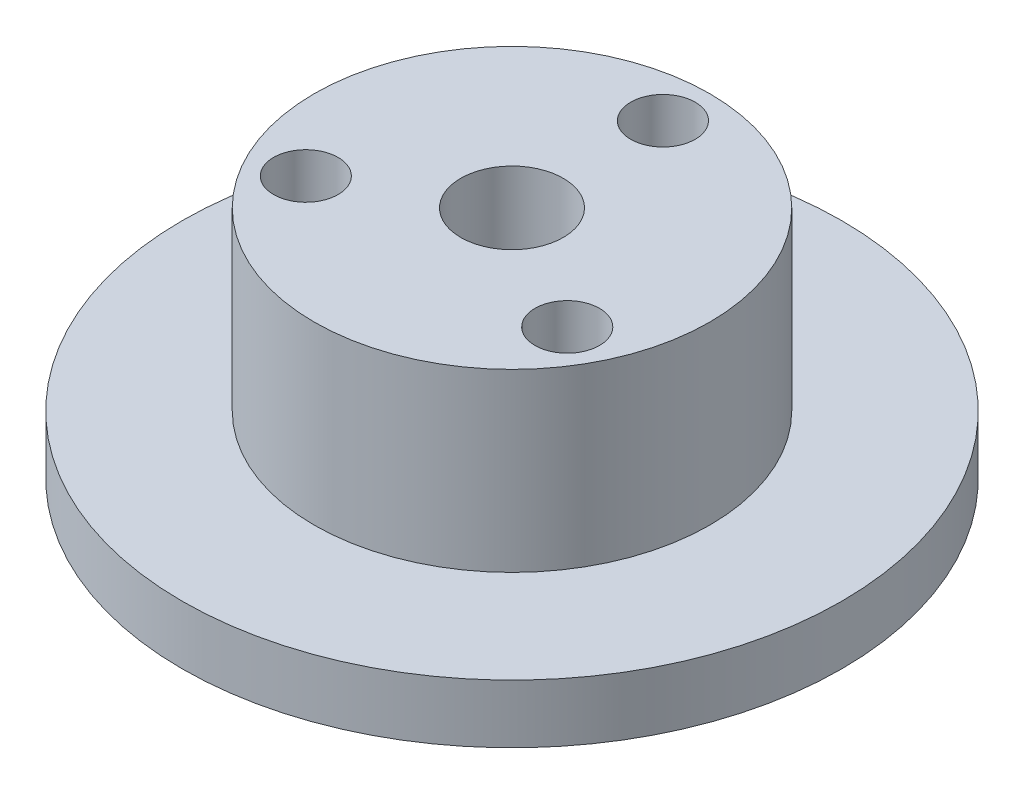
ISO-10303-21;
HEADER;
FILE_DESCRIPTION(('STEP AP214'),'2;1');
FILE_NAME('part.step','',(''),(''),'','','');
FILE_SCHEMA(('AUTOMOTIVE_DESIGN { 1 0 10303 214 1 1 1 1 }'));
ENDSEC;
DATA;
#1=APPLICATION_CONTEXT('core data for automotive mechanical design processes');
#2=APPLICATION_PROTOCOL_DEFINITION('international standard','automotive_design',2000,#1);
#3=PRODUCT_CONTEXT('',#1,'mechanical');
#4=PRODUCT('Part','Part','',(#3));
#5=PRODUCT_RELATED_PRODUCT_CATEGORY('part','',(#4));
#6=PRODUCT_DEFINITION_FORMATION('','',#4);
#7=PRODUCT_DEFINITION_CONTEXT('part definition',#1,'design');
#8=PRODUCT_DEFINITION('design','',#6,#7);
#9=PRODUCT_DEFINITION_SHAPE('','',#8);
#10=(LENGTH_UNIT() NAMED_UNIT(*) SI_UNIT(.MILLI.,.METRE.));
#11=(NAMED_UNIT(*) PLANE_ANGLE_UNIT() SI_UNIT($,.RADIAN.));
#12=(NAMED_UNIT(*) SI_UNIT($,.STERADIAN.) SOLID_ANGLE_UNIT());
#13=UNCERTAINTY_MEASURE_WITH_UNIT(LENGTH_MEASURE(1.E-05),#10,'distance_accuracy_value','');
#14=(GEOMETRIC_REPRESENTATION_CONTEXT(3) GLOBAL_UNCERTAINTY_ASSIGNED_CONTEXT((#13)) GLOBAL_UNIT_ASSIGNED_CONTEXT((#10,
#11,#12)) REPRESENTATION_CONTEXT('',''));
#15=CARTESIAN_POINT('',(0.,0.,0.));
#16=DIRECTION('',(0.,0.,1.));
#17=DIRECTION('',(1.,0.,0.));
#18=AXIS2_PLACEMENT_3D('',#15,#16,#17);
#19=CARTESIAN_POINT('',(0.,8.,0.));
#20=DIRECTION('',(0.,-1.,0.));
#21=DIRECTION('',(0.,0.,-1.));
#22=AXIS2_PLACEMENT_3D('',#19,#20,#21);
#23=CYLINDRICAL_SURFACE('',#22,11.25);
#24=CARTESIAN_POINT('',(0.,0.,0.));
#25=DIRECTION('',(0.,1.,0.));
#26=DIRECTION('',(0.,0.,1.));
#27=AXIS2_PLACEMENT_3D('',#24,#25,#26);
#28=CIRCLE('',#27,11.25);
#29=CARTESIAN_POINT('',(0.,0.,11.25));
#30=VERTEX_POINT('',#29);
#31=EDGE_CURVE('E10',#30,#30,#28,.T.);
#32=ORIENTED_EDGE('',*,*,#31,.T.);
#33=EDGE_LOOP('',(#32));
#34=FACE_BOUND('',#33,.T.);
#35=CARTESIAN_POINT('',(0.,2.,0.));
#36=DIRECTION('',(0.,1.,0.));
#37=DIRECTION('',(0.,0.,1.));
#38=AXIS2_PLACEMENT_3D('',#35,#36,#37);
#39=CIRCLE('',#38,11.25);
#40=CARTESIAN_POINT('',(0.,2.,11.25));
#41=VERTEX_POINT('',#40);
#42=EDGE_CURVE('E38',#41,#41,#39,.T.);
#43=ORIENTED_EDGE('',*,*,#42,.F.);
#44=EDGE_LOOP('',(#43));
#45=FACE_BOUND('',#44,.T.);
#46=ADVANCED_FACE('F32',(#34,#45),#23,.T.);
#47=CARTESIAN_POINT('',(0.,0.,0.));
#48=DIRECTION('',(0.,1.,0.));
#49=DIRECTION('',(0.,0.,1.));
#50=AXIS2_PLACEMENT_3D('',#47,#48,#49);
#51=PLANE('',#50);
#52=CARTESIAN_POINT('',(-4.46003082948953,0.,2.57500000000019));
#53=DIRECTION('',(0.,1.,0.));
#54=DIRECTION('',(0.,0.,1.));
#55=AXIS2_PLACEMENT_3D('',#52,#53,#54);
#56=CIRCLE('',#55,1.10000000000042);
#57=CARTESIAN_POINT('',(-4.46003082948953,0.,3.67500000000061));
#58=VERTEX_POINT('',#57);
#59=EDGE_CURVE('E61',#58,#58,#56,.T.);
#60=ORIENTED_EDGE('',*,*,#59,.T.);
#61=EDGE_LOOP('',(#60));
#62=FACE_BOUND('',#61,.T.);
#63=CARTESIAN_POINT('',(4.46003082949019,0.,2.57499999999981));
#64=DIRECTION('',(0.,1.,0.));
#65=DIRECTION('',(0.,0.,1.));
#66=AXIS2_PLACEMENT_3D('',#63,#64,#65);
#67=CIRCLE('',#66,1.10000000000028);
#68=CARTESIAN_POINT('',(4.46003082949019,0.,3.67500000000009));
#69=VERTEX_POINT('',#68);
#70=EDGE_CURVE('E67',#69,#69,#67,.T.);
#71=ORIENTED_EDGE('',*,*,#70,.T.);
#72=EDGE_LOOP('',(#71));
#73=FACE_BOUND('',#72,.T.);
#74=CARTESIAN_POINT('',(0.,0.,-5.15));
#75=DIRECTION('',(0.,1.,0.));
#76=DIRECTION('',(0.,0.,1.));
#77=AXIS2_PLACEMENT_3D('',#74,#75,#76);
#78=CIRCLE('',#77,1.1);
#79=CARTESIAN_POINT('',(0.,0.,-4.05));
#80=VERTEX_POINT('',#79);
#81=EDGE_CURVE('E55',#80,#80,#78,.T.);
#82=ORIENTED_EDGE('',*,*,#81,.T.);
#83=EDGE_LOOP('',(#82));
#84=FACE_BOUND('',#83,.T.);
#85=CARTESIAN_POINT('',(0.,0.,0.));
#86=DIRECTION('',(0.,1.,0.));
#87=DIRECTION('',(0.,0.,1.));
#88=AXIS2_PLACEMENT_3D('',#85,#86,#87);
#89=CIRCLE('',#88,1.75);
#90=CARTESIAN_POINT('',(0.,0.,1.75));
#91=VERTEX_POINT('',#90);
#92=EDGE_CURVE('E50',#91,#91,#89,.T.);
#93=ORIENTED_EDGE('',*,*,#92,.T.);
#94=EDGE_LOOP('',(#93));
#95=FACE_BOUND('',#94,.T.);
#96=ORIENTED_EDGE('',*,*,#31,.F.);
#97=EDGE_LOOP('',(#96));
#98=FACE_BOUND('',#97,.T.);
#99=ADVANCED_FACE('F76',(#62,#73,#84,#95,#98),#51,.F.);
#100=CARTESIAN_POINT('',(0.,2.,0.));
#101=DIRECTION('',(0.,1.,0.));
#102=DIRECTION('',(0.,0.,1.));
#103=AXIS2_PLACEMENT_3D('',#100,#101,#102);
#104=PLANE('',#103);
#105=CARTESIAN_POINT('',(0.,2.,0.));
#106=DIRECTION('',(0.,1.,0.));
#107=DIRECTION('',(0.,0.,1.));
#108=AXIS2_PLACEMENT_3D('',#105,#106,#107);
#109=CIRCLE('',#108,6.75);
#110=CARTESIAN_POINT('',(0.,2.,6.75));
#111=VERTEX_POINT('',#110);
#112=EDGE_CURVE('E42',#111,#111,#109,.T.);
#113=ORIENTED_EDGE('',*,*,#112,.F.);
#114=EDGE_LOOP('',(#113));
#115=FACE_BOUND('',#114,.T.);
#116=ORIENTED_EDGE('',*,*,#42,.T.);
#117=EDGE_LOOP('',(#116));
#118=FACE_BOUND('',#117,.T.);
#119=ADVANCED_FACE('F98',(#115,#118),#104,.T.);
#120=CARTESIAN_POINT('',(0.,2.,0.));
#121=DIRECTION('',(0.,1.,0.));
#122=DIRECTION('',(0.,0.,1.));
#123=AXIS2_PLACEMENT_3D('',#120,#121,#122);
#124=CYLINDRICAL_SURFACE('',#123,6.75);
#125=ORIENTED_EDGE('',*,*,#112,.T.);
#126=EDGE_LOOP('',(#125));
#127=FACE_BOUND('',#126,.T.);
#128=CARTESIAN_POINT('',(0.,8.,0.));
#129=DIRECTION('',(0.,1.,0.));
#130=DIRECTION('',(0.,0.,1.));
#131=AXIS2_PLACEMENT_3D('',#128,#129,#130);
#132=CIRCLE('',#131,6.75);
#133=CARTESIAN_POINT('',(0.,8.,6.75));
#134=VERTEX_POINT('',#133);
#135=EDGE_CURVE('E46',#134,#134,#132,.T.);
#136=ORIENTED_EDGE('',*,*,#135,.F.);
#137=EDGE_LOOP('',(#136));
#138=FACE_BOUND('',#137,.T.);
#139=ADVANCED_FACE('F90',(#127,#138),#124,.T.);
#140=CARTESIAN_POINT('',(0.,8.,0.));
#141=DIRECTION('',(0.,1.,0.));
#142=DIRECTION('',(0.,0.,1.));
#143=AXIS2_PLACEMENT_3D('',#140,#141,#142);
#144=PLANE('',#143);
#145=CARTESIAN_POINT('',(-4.46003082948953,8.,2.57500000000019));
#146=DIRECTION('',(0.,1.,0.));
#147=DIRECTION('',(0.,0.,1.));
#148=AXIS2_PLACEMENT_3D('',#145,#146,#147);
#149=CIRCLE('',#148,1.10000000000042);
#150=CARTESIAN_POINT('',(-4.46003082948953,8.,3.67500000000061));
#151=VERTEX_POINT('',#150);
#152=EDGE_CURVE('E58',#151,#151,#149,.T.);
#153=ORIENTED_EDGE('',*,*,#152,.F.);
#154=EDGE_LOOP('',(#153));
#155=FACE_BOUND('',#154,.T.);
#156=CARTESIAN_POINT('',(4.46003082949019,8.,2.57499999999981));
#157=DIRECTION('',(0.,1.,0.));
#158=DIRECTION('',(0.,0.,1.));
#159=AXIS2_PLACEMENT_3D('',#156,#157,#158);
#160=CIRCLE('',#159,1.10000000000028);
#161=CARTESIAN_POINT('',(4.46003082949019,8.,3.67500000000009));
#162=VERTEX_POINT('',#161);
#163=EDGE_CURVE('E64',#162,#162,#160,.T.);
#164=ORIENTED_EDGE('',*,*,#163,.F.);
#165=EDGE_LOOP('',(#164));
#166=FACE_BOUND('',#165,.T.);
#167=CARTESIAN_POINT('',(0.,8.,-5.15));
#168=DIRECTION('',(0.,1.,0.));
#169=DIRECTION('',(0.,0.,1.));
#170=AXIS2_PLACEMENT_3D('',#167,#168,#169);
#171=CIRCLE('',#170,1.1);
#172=CARTESIAN_POINT('',(0.,8.,-4.05));
#173=VERTEX_POINT('',#172);
#174=EDGE_CURVE('E70',#173,#173,#171,.T.);
#175=ORIENTED_EDGE('',*,*,#174,.F.);
#176=EDGE_LOOP('',(#175));
#177=FACE_BOUND('',#176,.T.);
#178=CARTESIAN_POINT('',(0.,8.,0.));
#179=DIRECTION('',(0.,1.,0.));
#180=DIRECTION('',(0.,0.,1.));
#181=AXIS2_PLACEMENT_3D('',#178,#179,#180);
#182=CIRCLE('',#181,1.75);
#183=CARTESIAN_POINT('',(0.,8.,1.75));
#184=VERTEX_POINT('',#183);
#185=EDGE_CURVE('E52',#184,#184,#182,.T.);
#186=ORIENTED_EDGE('',*,*,#185,.F.);
#187=EDGE_LOOP('',(#186));
#188=FACE_BOUND('',#187,.T.);
#189=ORIENTED_EDGE('',*,*,#135,.T.);
#190=EDGE_LOOP('',(#189));
#191=FACE_BOUND('',#190,.T.);
#192=ADVANCED_FACE('F87',(#155,#166,#177,#188,#191),#144,.T.);
#193=CARTESIAN_POINT('',(0.,0.,0.));
#194=DIRECTION('',(0.,1.,0.));
#195=DIRECTION('',(0.,0.,1.));
#196=AXIS2_PLACEMENT_3D('',#193,#194,#195);
#197=CYLINDRICAL_SURFACE('',#196,1.75);
#198=ORIENTED_EDGE('',*,*,#92,.F.);
#199=EDGE_LOOP('',(#198));
#200=FACE_BOUND('',#199,.T.);
#201=ORIENTED_EDGE('',*,*,#185,.T.);
#202=EDGE_LOOP('',(#201));
#203=FACE_BOUND('',#202,.T.);
#204=ADVANCED_FACE('F83',(#200,#203),#197,.F.);
#205=CARTESIAN_POINT('',(0.,0.,-5.15));
#206=DIRECTION('',(0.,1.,0.));
#207=DIRECTION('',(0.,0.,1.));
#208=AXIS2_PLACEMENT_3D('',#205,#206,#207);
#209=CYLINDRICAL_SURFACE('',#208,1.1);
#210=ORIENTED_EDGE('',*,*,#81,.F.);
#211=EDGE_LOOP('',(#210));
#212=FACE_BOUND('',#211,.T.);
#213=ORIENTED_EDGE('',*,*,#174,.T.);
#214=EDGE_LOOP('',(#213));
#215=FACE_BOUND('',#214,.T.);
#216=ADVANCED_FACE('F79',(#212,#215),#209,.F.);
#217=CARTESIAN_POINT('',(4.46003082949019,0.,2.57499999999981));
#218=DIRECTION('',(0.,1.,0.));
#219=DIRECTION('',(0.,0.,1.));
#220=AXIS2_PLACEMENT_3D('',#217,#218,#219);
#221=CYLINDRICAL_SURFACE('',#220,1.10000000000028);
#222=ORIENTED_EDGE('',*,*,#70,.F.);
#223=EDGE_LOOP('',(#222));
#224=FACE_BOUND('',#223,.T.);
#225=ORIENTED_EDGE('',*,*,#163,.T.);
#226=EDGE_LOOP('',(#225));
#227=FACE_BOUND('',#226,.T.);
#228=ADVANCED_FACE('F82',(#224,#227),#221,.F.);
#229=CARTESIAN_POINT('',(-4.46003082948953,0.,2.57500000000019));
#230=DIRECTION('',(0.,1.,0.));
#231=DIRECTION('',(0.,0.,1.));
#232=AXIS2_PLACEMENT_3D('',#229,#230,#231);
#233=CYLINDRICAL_SURFACE('',#232,1.10000000000042);
#234=ORIENTED_EDGE('',*,*,#59,.F.);
#235=EDGE_LOOP('',(#234));
#236=FACE_BOUND('',#235,.T.);
#237=ORIENTED_EDGE('',*,*,#152,.T.);
#238=EDGE_LOOP('',(#237));
#239=FACE_BOUND('',#238,.T.);
#240=ADVANCED_FACE('F121',(#236,#239),#233,.F.);
#241=CLOSED_SHELL('',(#46,#99,#119,#139,#192,#204,#216,#228,#240));
#242=MANIFOLD_SOLID_BREP('B2',#241);
#243=ADVANCED_BREP_SHAPE_REPRESENTATION('',(#18,#242),#14);
#244=SHAPE_DEFINITION_REPRESENTATION(#9,#243);
ENDSEC;
END-ISO-10303-21;
